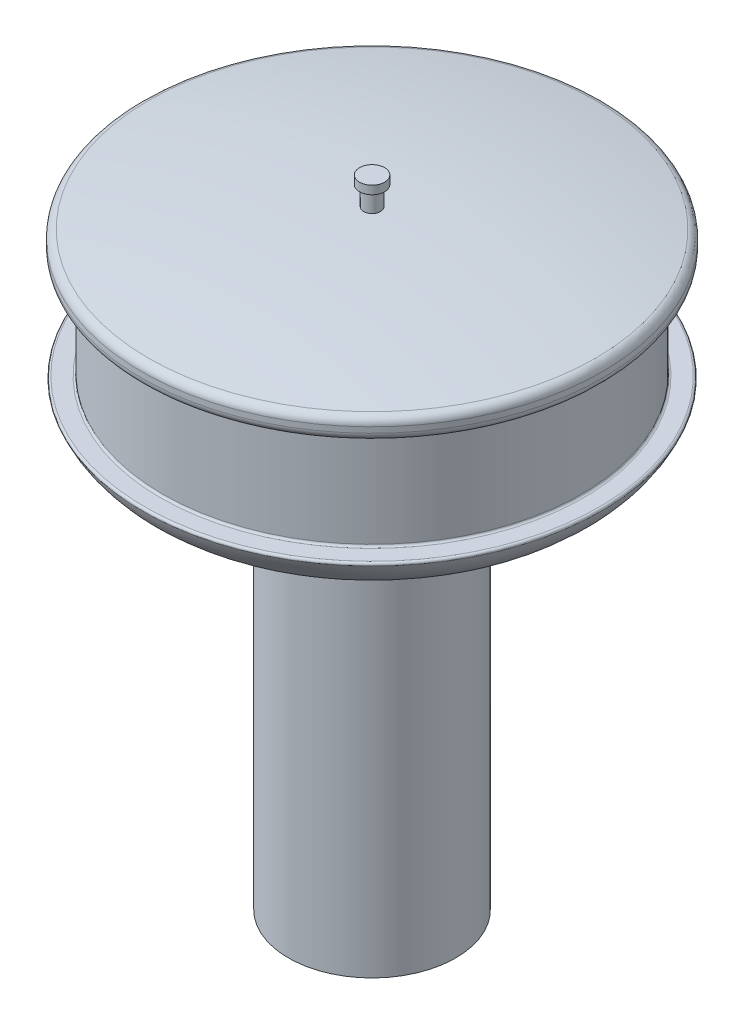
ISO-10303-21;
HEADER;
FILE_DESCRIPTION(('STEP AP214'),'2;1');
FILE_NAME('part.step','',(''),(''),'','','');
FILE_SCHEMA(('AUTOMOTIVE_DESIGN { 1 0 10303 214 1 1 1 1 }'));
ENDSEC;
DATA;
#1=APPLICATION_CONTEXT('core data for automotive mechanical design processes');
#2=APPLICATION_PROTOCOL_DEFINITION('international standard','automotive_design',2000,#1);
#3=PRODUCT_CONTEXT('',#1,'mechanical');
#4=PRODUCT('Part','Part','',(#3));
#5=PRODUCT_RELATED_PRODUCT_CATEGORY('part','',(#4));
#6=PRODUCT_DEFINITION_FORMATION('','',#4);
#7=PRODUCT_DEFINITION_CONTEXT('part definition',#1,'design');
#8=PRODUCT_DEFINITION('design','',#6,#7);
#9=PRODUCT_DEFINITION_SHAPE('','',#8);
#10=(LENGTH_UNIT() NAMED_UNIT(*) SI_UNIT(.MILLI.,.METRE.));
#11=(NAMED_UNIT(*) PLANE_ANGLE_UNIT() SI_UNIT($,.RADIAN.));
#12=(NAMED_UNIT(*) SI_UNIT($,.STERADIAN.) SOLID_ANGLE_UNIT());
#13=UNCERTAINTY_MEASURE_WITH_UNIT(LENGTH_MEASURE(1.E-05),#10,'distance_accuracy_value','');
#14=(GEOMETRIC_REPRESENTATION_CONTEXT(3) GLOBAL_UNCERTAINTY_ASSIGNED_CONTEXT((#13)) GLOBAL_UNIT_ASSIGNED_CONTEXT((#10,
#11,#12)) REPRESENTATION_CONTEXT('',''));
#15=CARTESIAN_POINT('',(0.,0.,0.));
#16=DIRECTION('',(0.,0.,1.));
#17=DIRECTION('',(1.,0.,0.));
#18=AXIS2_PLACEMENT_3D('',#15,#16,#17);
#19=CARTESIAN_POINT('',(0.,62.,0.));
#20=DIRECTION('',(0.,-1.,0.));
#21=DIRECTION('',(0.,0.,-1.));
#22=AXIS2_PLACEMENT_3D('',#19,#20,#21);
#23=PLANE('',#22);
#24=CARTESIAN_POINT('',(0.,62.,0.));
#25=DIRECTION('',(0.,-1.,0.));
#26=DIRECTION('',(0.,0.,-1.));
#27=AXIS2_PLACEMENT_3D('',#24,#25,#26);
#28=CIRCLE('',#27,40.);
#29=CARTESIAN_POINT('',(0.,62.,-40.));
#30=VERTEX_POINT('',#29);
#31=EDGE_CURVE('E75',#30,#30,#28,.T.);
#32=ORIENTED_EDGE('',*,*,#31,.F.);
#33=EDGE_LOOP('',(#32));
#34=FACE_BOUND('',#33,.T.);
#35=CARTESIAN_POINT('',(0.,62.,0.));
#36=DIRECTION('',(0.,-1.,0.));
#37=DIRECTION('',(0.,0.,-1.));
#38=AXIS2_PLACEMENT_3D('',#35,#36,#37);
#39=CIRCLE('',#38,22.);
#40=CARTESIAN_POINT('',(0.,62.,-22.));
#41=VERTEX_POINT('',#40);
#42=EDGE_CURVE('E11',#41,#41,#39,.T.);
#43=ORIENTED_EDGE('',*,*,#42,.T.);
#44=EDGE_LOOP('',(#43));
#45=FACE_BOUND('',#44,.T.);
#46=ADVANCED_FACE('F38',(#34,#45),#23,.F.);
#47=CARTESIAN_POINT('',(0.,58.,0.));
#48=DIRECTION('',(0.,-1.,0.));
#49=DIRECTION('',(0.,0.,-1.));
#50=AXIS2_PLACEMENT_3D('',#47,#48,#49);
#51=TOROIDAL_SURFACE('',#50,22.,4.);
#52=CARTESIAN_POINT('',(0.,58.,0.));
#53=DIRECTION('',(0.,-1.,0.));
#54=DIRECTION('',(0.,0.,-1.));
#55=AXIS2_PLACEMENT_3D('',#52,#53,#54);
#56=CIRCLE('',#55,18.);
#57=CARTESIAN_POINT('',(0.,58.,-18.));
#58=VERTEX_POINT('',#57);
#59=EDGE_CURVE('E44',#58,#58,#56,.T.);
#60=ORIENTED_EDGE('',*,*,#59,.T.);
#61=EDGE_LOOP('',(#60));
#62=FACE_BOUND('',#61,.T.);
#63=ORIENTED_EDGE('',*,*,#42,.F.);
#64=EDGE_LOOP('',(#63));
#65=FACE_BOUND('',#64,.T.);
#66=ADVANCED_FACE('F65',(#62,#65),#51,.T.);
#67=CARTESIAN_POINT('',(0.,0.,0.));
#68=DIRECTION('',(0.,-1.,0.));
#69=DIRECTION('',(0.,0.,-1.));
#70=AXIS2_PLACEMENT_3D('',#67,#68,#69);
#71=CYLINDRICAL_SURFACE('',#70,18.);
#72=ORIENTED_EDGE('',*,*,#59,.F.);
#73=EDGE_LOOP('',(#72));
#74=FACE_BOUND('',#73,.T.);
#75=CARTESIAN_POINT('',(0.,-40.,0.));
#76=DIRECTION('',(0.,-1.,0.));
#77=DIRECTION('',(0.,0.,-1.));
#78=AXIS2_PLACEMENT_3D('',#75,#76,#77);
#79=CIRCLE('',#78,18.);
#80=CARTESIAN_POINT('',(0.,-40.,-18.));
#81=VERTEX_POINT('',#80);
#82=EDGE_CURVE('E153',#81,#81,#79,.T.);
#83=ORIENTED_EDGE('',*,*,#82,.T.);
#84=EDGE_LOOP('',(#83));
#85=FACE_BOUND('',#84,.T.);
#86=ADVANCED_FACE('F70',(#74,#85),#71,.F.);
#87=CARTESIAN_POINT('',(0.,-40.,0.));
#88=DIRECTION('',(0.,-1.,0.));
#89=DIRECTION('',(0.,0.,-1.));
#90=AXIS2_PLACEMENT_3D('',#87,#88,#89);
#91=PLANE('',#90);
#92=CARTESIAN_POINT('',(0.,-40.,0.));
#93=DIRECTION('',(0.,-1.,0.));
#94=DIRECTION('',(0.,0.,-1.));
#95=AXIS2_PLACEMENT_3D('',#92,#93,#94);
#96=CIRCLE('',#95,20.);
#97=CARTESIAN_POINT('',(0.,-40.,-20.));
#98=VERTEX_POINT('',#97);
#99=EDGE_CURVE('E150',#98,#98,#96,.T.);
#100=ORIENTED_EDGE('',*,*,#99,.T.);
#101=EDGE_LOOP('',(#100));
#102=FACE_BOUND('',#101,.T.);
#103=ORIENTED_EDGE('',*,*,#82,.F.);
#104=EDGE_LOOP('',(#103));
#105=FACE_BOUND('',#104,.T.);
#106=ADVANCED_FACE('F160',(#102,#105),#91,.T.);
#107=CARTESIAN_POINT('',(0.,0.,0.));
#108=DIRECTION('',(0.,-1.,0.));
#109=DIRECTION('',(0.,0.,-1.));
#110=AXIS2_PLACEMENT_3D('',#107,#108,#109);
#111=CYLINDRICAL_SURFACE('',#110,20.);
#112=CARTESIAN_POINT('',(0.,58.,0.));
#113=DIRECTION('',(0.,-1.,0.));
#114=DIRECTION('',(0.,0.,-1.));
#115=AXIS2_PLACEMENT_3D('',#112,#113,#114);
#116=CIRCLE('',#115,20.);
#117=CARTESIAN_POINT('',(0.,58.,-20.));
#118=VERTEX_POINT('',#117);
#119=EDGE_CURVE('E147',#118,#118,#116,.T.);
#120=ORIENTED_EDGE('',*,*,#119,.T.);
#121=EDGE_LOOP('',(#120));
#122=FACE_BOUND('',#121,.T.);
#123=ORIENTED_EDGE('',*,*,#99,.F.);
#124=EDGE_LOOP('',(#123));
#125=FACE_BOUND('',#124,.T.);
#126=ADVANCED_FACE('F165',(#122,#125),#111,.T.);
#127=CARTESIAN_POINT('',(0.,58.,0.));
#128=DIRECTION('',(0.,-1.,0.));
#129=DIRECTION('',(0.,0.,-1.));
#130=AXIS2_PLACEMENT_3D('',#127,#128,#129);
#131=TOROIDAL_SURFACE('',#130,22.,2.);
#132=ORIENTED_EDGE('',*,*,#119,.F.);
#133=EDGE_LOOP('',(#132));
#134=FACE_BOUND('',#133,.T.);
#135=CARTESIAN_POINT('',(0.,60.,0.));
#136=DIRECTION('',(0.,-1.,0.));
#137=DIRECTION('',(0.,0.,-1.));
#138=AXIS2_PLACEMENT_3D('',#135,#136,#137);
#139=CIRCLE('',#138,22.);
#140=CARTESIAN_POINT('',(0.,60.,-22.));
#141=VERTEX_POINT('',#140);
#142=EDGE_CURVE('E144',#141,#141,#139,.T.);
#143=ORIENTED_EDGE('',*,*,#142,.T.);
#144=EDGE_LOOP('',(#143));
#145=FACE_BOUND('',#144,.T.);
#146=ADVANCED_FACE('F171',(#134,#145),#131,.F.);
#147=CARTESIAN_POINT('',(0.,60.,0.));
#148=DIRECTION('',(0.,-1.,0.));
#149=DIRECTION('',(0.,0.,-1.));
#150=AXIS2_PLACEMENT_3D('',#147,#148,#149);
#151=PLANE('',#150);
#152=CARTESIAN_POINT('',(0.,60.,0.));
#153=DIRECTION('',(0.,-1.,0.));
#154=DIRECTION('',(0.,0.,-1.));
#155=AXIS2_PLACEMENT_3D('',#152,#153,#154);
#156=CIRCLE('',#155,40.);
#157=CARTESIAN_POINT('',(0.,60.,-40.));
#158=VERTEX_POINT('',#157);
#159=EDGE_CURVE('E141',#158,#158,#156,.T.);
#160=ORIENTED_EDGE('',*,*,#159,.T.);
#161=EDGE_LOOP('',(#160));
#162=FACE_BOUND('',#161,.T.);
#163=ORIENTED_EDGE('',*,*,#142,.F.);
#164=EDGE_LOOP('',(#163));
#165=FACE_BOUND('',#164,.T.);
#166=ADVANCED_FACE('F177',(#162,#165),#151,.T.);
#167=CARTESIAN_POINT('',(0.,76.,0.));
#168=DIRECTION('',(0.,-1.,0.));
#169=DIRECTION('',(0.,0.,-1.));
#170=AXIS2_PLACEMENT_3D('',#167,#168,#169);
#171=TOROIDAL_SURFACE('',#170,40.,16.);
#172=CARTESIAN_POINT('',(0.,69.7365013028851,0.));
#173=DIRECTION('',(0.,-1.,0.));
#174=DIRECTION('',(0.,0.,-1.));
#175=AXIS2_PLACEMENT_3D('',#172,#173,#174);
#176=CIRCLE('',#175,54.7230629989565);
#177=CARTESIAN_POINT('',(0.,69.7365013028851,-54.7230629989565));
#178=VERTEX_POINT('',#177);
#179=EDGE_CURVE('E138',#178,#178,#176,.T.);
#180=ORIENTED_EDGE('',*,*,#179,.T.);
#181=EDGE_LOOP('',(#180));
#182=FACE_BOUND('',#181,.T.);
#183=ORIENTED_EDGE('',*,*,#159,.F.);
#184=EDGE_LOOP('',(#183));
#185=FACE_BOUND('',#184,.T.);
#186=ADVANCED_FACE('F181',(#182,#185),#171,.T.);
#187=CARTESIAN_POINT('',(0.,69.93223563717,0.));
#188=DIRECTION('',(0.,-1.,0.));
#189=DIRECTION('',(0.,0.,-1.));
#190=AXIS2_PLACEMENT_3D('',#187,#188,#189);
#191=TOROIDAL_SURFACE('',#190,54.2629672802391,0.499999999999995);
#192=ORIENTED_EDGE('',*,*,#179,.F.);
#193=EDGE_LOOP('',(#192));
#194=FACE_BOUND('',#193,.T.);
#195=CARTESIAN_POINT('',(0.,70.43223563717,0.));
#196=DIRECTION('',(0.,-1.,0.));
#197=DIRECTION('',(0.,0.,-1.));
#198=AXIS2_PLACEMENT_3D('',#195,#196,#197);
#199=CIRCLE('',#198,54.2629672802391);
#200=CARTESIAN_POINT('',(0.,70.43223563717,-54.2629672802391));
#201=VERTEX_POINT('',#200);
#202=EDGE_CURVE('E135',#201,#201,#199,.T.);
#203=ORIENTED_EDGE('',*,*,#202,.T.);
#204=EDGE_LOOP('',(#203));
#205=FACE_BOUND('',#204,.T.);
#206=ADVANCED_FACE('F185',(#194,#205),#191,.T.);
#207=CARTESIAN_POINT('',(2.59753420162755E-13,70.43223563717,0.));
#208=DIRECTION('',(0.,1.,0.));
#209=DIRECTION('',(0.,0.,1.));
#210=AXIS2_PLACEMENT_3D('',#207,#208,#209);
#211=PLANE('',#210);
#212=CARTESIAN_POINT('',(0.,70.43223563717,0.));
#213=DIRECTION('',(0.,-1.,0.));
#214=DIRECTION('',(0.,0.,-1.));
#215=AXIS2_PLACEMENT_3D('',#212,#213,#214);
#216=CIRCLE('',#215,50.5);
#217=CARTESIAN_POINT('',(0.,70.43223563717,-50.5));
#218=VERTEX_POINT('',#217);
#219=EDGE_CURVE('E132',#218,#218,#216,.T.);
#220=ORIENTED_EDGE('',*,*,#219,.T.);
#221=EDGE_LOOP('',(#220));
#222=FACE_BOUND('',#221,.T.);
#223=ORIENTED_EDGE('',*,*,#202,.F.);
#224=EDGE_LOOP('',(#223));
#225=FACE_BOUND('',#224,.T.);
#226=ADVANCED_FACE('F189',(#222,#225),#211,.T.);
#227=CARTESIAN_POINT('',(0.,70.93223563717,0.));
#228=DIRECTION('',(0.,-1.,0.));
#229=DIRECTION('',(0.,0.,-1.));
#230=AXIS2_PLACEMENT_3D('',#227,#228,#229);
#231=TOROIDAL_SURFACE('',#230,50.5,0.5);
#232=ORIENTED_EDGE('',*,*,#219,.F.);
#233=EDGE_LOOP('',(#232));
#234=FACE_BOUND('',#233,.T.);
#235=CARTESIAN_POINT('',(0.,70.93223563717,0.));
#236=DIRECTION('',(0.,-1.,0.));
#237=DIRECTION('',(0.,0.,-1.));
#238=AXIS2_PLACEMENT_3D('',#235,#236,#237);
#239=CIRCLE('',#238,50.);
#240=CARTESIAN_POINT('',(0.,70.93223563717,-50.));
#241=VERTEX_POINT('',#240);
#242=EDGE_CURVE('E129',#241,#241,#239,.T.);
#243=ORIENTED_EDGE('',*,*,#242,.T.);
#244=EDGE_LOOP('',(#243));
#245=FACE_BOUND('',#244,.T.);
#246=ADVANCED_FACE('F193',(#234,#245),#231,.F.);
#247=CARTESIAN_POINT('',(0.,0.,0.));
#248=DIRECTION('',(0.,-1.,0.));
#249=DIRECTION('',(0.,0.,-1.));
#250=AXIS2_PLACEMENT_3D('',#247,#248,#249);
#251=CYLINDRICAL_SURFACE('',#250,50.);
#252=CARTESIAN_POINT('',(0.,94.93223563717,0.));
#253=DIRECTION('',(0.,-1.,0.));
#254=DIRECTION('',(0.,0.,-1.));
#255=AXIS2_PLACEMENT_3D('',#252,#253,#254);
#256=CIRCLE('',#255,50.);
#257=CARTESIAN_POINT('',(0.,94.93223563717,-50.));
#258=VERTEX_POINT('',#257);
#259=EDGE_CURVE('E126',#258,#258,#256,.T.);
#260=ORIENTED_EDGE('',*,*,#259,.T.);
#261=EDGE_LOOP('',(#260));
#262=FACE_BOUND('',#261,.T.);
#263=ORIENTED_EDGE('',*,*,#242,.F.);
#264=EDGE_LOOP('',(#263));
#265=FACE_BOUND('',#264,.T.);
#266=ADVANCED_FACE('F197',(#262,#265),#251,.T.);
#267=CARTESIAN_POINT('',(0.,94.93223563717,0.));
#268=DIRECTION('',(0.,-1.,0.));
#269=DIRECTION('',(0.,0.,-1.));
#270=AXIS2_PLACEMENT_3D('',#267,#268,#269);
#271=TOROIDAL_SURFACE('',#270,50.5,0.5);
#272=ORIENTED_EDGE('',*,*,#259,.F.);
#273=EDGE_LOOP('',(#272));
#274=FACE_BOUND('',#273,.T.);
#275=CARTESIAN_POINT('',(0.,95.43223563717,0.));
#276=DIRECTION('',(0.,-1.,0.));
#277=DIRECTION('',(0.,0.,-1.));
#278=AXIS2_PLACEMENT_3D('',#275,#276,#277);
#279=CIRCLE('',#278,50.5);
#280=CARTESIAN_POINT('',(0.,95.43223563717,-50.5));
#281=VERTEX_POINT('',#280);
#282=EDGE_CURVE('E123',#281,#281,#279,.T.);
#283=ORIENTED_EDGE('',*,*,#282,.T.);
#284=EDGE_LOOP('',(#283));
#285=FACE_BOUND('',#284,.T.);
#286=ADVANCED_FACE('F201',(#274,#285),#271,.F.);
#287=CARTESIAN_POINT('',(0.,95.43223563717,0.));
#288=DIRECTION('',(0.,-1.,0.));
#289=DIRECTION('',(0.,0.,-1.));
#290=AXIS2_PLACEMENT_3D('',#287,#288,#289);
#291=PLANE('',#290);
#292=CARTESIAN_POINT('',(0.,95.43223563717,0.));
#293=DIRECTION('',(0.,-1.,0.));
#294=DIRECTION('',(0.,0.,-1.));
#295=AXIS2_PLACEMENT_3D('',#292,#293,#294);
#296=CIRCLE('',#295,53.);
#297=CARTESIAN_POINT('',(0.,95.43223563717,-53.));
#298=VERTEX_POINT('',#297);
#299=EDGE_CURVE('E120',#298,#298,#296,.T.);
#300=ORIENTED_EDGE('',*,*,#299,.T.);
#301=EDGE_LOOP('',(#300));
#302=FACE_BOUND('',#301,.T.);
#303=ORIENTED_EDGE('',*,*,#282,.F.);
#304=EDGE_LOOP('',(#303));
#305=FACE_BOUND('',#304,.T.);
#306=ADVANCED_FACE('F205',(#302,#305),#291,.T.);
#307=CARTESIAN_POINT('',(0.,97.43223563717,0.));
#308=DIRECTION('',(0.,-1.,0.));
#309=DIRECTION('',(0.,0.,-1.));
#310=AXIS2_PLACEMENT_3D('',#307,#308,#309);
#311=TOROIDAL_SURFACE('',#310,53.,2.);
#312=CARTESIAN_POINT('',(0.,97.43223563717,0.));
#313=DIRECTION('',(0.,-1.,0.));
#314=DIRECTION('',(0.,0.,-1.));
#315=AXIS2_PLACEMENT_3D('',#312,#313,#314);
#316=CIRCLE('',#315,55.);
#317=CARTESIAN_POINT('',(0.,97.43223563717,-55.));
#318=VERTEX_POINT('',#317);
#319=EDGE_CURVE('E117',#318,#318,#316,.T.);
#320=ORIENTED_EDGE('',*,*,#319,.T.);
#321=EDGE_LOOP('',(#320));
#322=FACE_BOUND('',#321,.T.);
#323=ORIENTED_EDGE('',*,*,#299,.F.);
#324=EDGE_LOOP('',(#323));
#325=FACE_BOUND('',#324,.T.);
#326=ADVANCED_FACE('F209',(#322,#325),#311,.T.);
#327=CARTESIAN_POINT('',(0.,0.,0.));
#328=DIRECTION('',(0.,-1.,0.));
#329=DIRECTION('',(0.,0.,-1.));
#330=AXIS2_PLACEMENT_3D('',#327,#328,#329);
#331=CYLINDRICAL_SURFACE('',#330,55.);
#332=ORIENTED_EDGE('',*,*,#319,.F.);
#333=EDGE_LOOP('',(#332));
#334=FACE_BOUND('',#333,.T.);
#335=CARTESIAN_POINT('',(0.,98.770348737419,0.));
#336=DIRECTION('',(0.,-1.,0.));
#337=DIRECTION('',(0.,0.,-1.));
#338=AXIS2_PLACEMENT_3D('',#335,#336,#337);
#339=CIRCLE('',#338,55.);
#340=CARTESIAN_POINT('',(0.,98.770348737419,-55.));
#341=VERTEX_POINT('',#340);
#342=EDGE_CURVE('E114',#341,#341,#339,.T.);
#343=ORIENTED_EDGE('',*,*,#342,.T.);
#344=EDGE_LOOP('',(#343));
#345=FACE_BOUND('',#344,.T.);
#346=ADVANCED_FACE('F213',(#334,#345),#331,.T.);
#347=CARTESIAN_POINT('',(0.,98.770348737419,0.));
#348=DIRECTION('',(0.,-1.,0.));
#349=DIRECTION('',(0.,0.,-1.));
#350=AXIS2_PLACEMENT_3D('',#347,#348,#349);
#351=TOROIDAL_SURFACE('',#350,53.,2.00000000000003);
#352=CARTESIAN_POINT('',(0.,100.737600445058,0.));
#353=DIRECTION('',(0.,-1.,0.));
#354=DIRECTION('',(0.,0.,-1.));
#355=AXIS2_PLACEMENT_3D('',#352,#353,#354);
#356=CIRCLE('',#355,53.3604451675248);
#357=CARTESIAN_POINT('',(0.,100.737600445058,-53.3604451675248));
#358=VERTEX_POINT('',#357);
#359=EDGE_CURVE('E111',#358,#358,#356,.T.);
#360=ORIENTED_EDGE('',*,*,#359,.T.);
#361=EDGE_LOOP('',(#360));
#362=FACE_BOUND('',#361,.T.);
#363=ORIENTED_EDGE('',*,*,#342,.F.);
#364=EDGE_LOOP('',(#363));
#365=FACE_BOUND('',#364,.T.);
#366=ADVANCED_FACE('F217',(#362,#365),#351,.T.);
#367=CARTESIAN_POINT('',(0.,-179.579442379339,0.));
#368=DIRECTION('',(0.,-1.,0.));
#369=DIRECTION('',(0.,0.,-1.));
#370=AXIS2_PLACEMENT_3D('',#367,#368,#369);
#371=DEGENERATE_TOROIDAL_SURFACE('',#370,2.00000000000004,284.983402719564,.T.);
#372=ORIENTED_EDGE('',*,*,#359,.F.);
#373=EDGE_LOOP('',(#372));
#374=FACE_BOUND('',#373,.T.);
#375=CARTESIAN_POINT('',(0.,105.403960340225,0.));
#376=DIRECTION('',(0.,-1.,0.));
#377=DIRECTION('',(0.,0.,-1.));
#378=AXIS2_PLACEMENT_3D('',#375,#376,#377);
#379=CIRCLE('',#378,2.);
#380=CARTESIAN_POINT('',(0.,105.403960340225,-2.));
#381=VERTEX_POINT('',#380);
#382=EDGE_CURVE('E107',#381,#381,#379,.T.);
#383=ORIENTED_EDGE('',*,*,#382,.T.);
#384=EDGE_LOOP('',(#383));
#385=FACE_BOUND('',#384,.T.);
#386=ADVANCED_FACE('F60',(#374,#385),#371,.T.);
#387=CARTESIAN_POINT('',(0.,0.,0.));
#388=DIRECTION('',(0.,-1.,0.));
#389=DIRECTION('',(0.,0.,-1.));
#390=AXIS2_PLACEMENT_3D('',#387,#388,#389);
#391=CYLINDRICAL_SURFACE('',#390,2.);
#392=ORIENTED_EDGE('',*,*,#382,.F.);
#393=EDGE_LOOP('',(#392));
#394=FACE_BOUND('',#393,.T.);
#395=CARTESIAN_POINT('',(0.,110.,0.));
#396=DIRECTION('',(0.,-1.,0.));
#397=DIRECTION('',(0.,0.,-1.));
#398=AXIS2_PLACEMENT_3D('',#395,#396,#397);
#399=CIRCLE('',#398,2.);
#400=CARTESIAN_POINT('',(0.,110.,-2.));
#401=VERTEX_POINT('',#400);
#402=EDGE_CURVE('E80',#401,#401,#399,.T.);
#403=ORIENTED_EDGE('',*,*,#402,.T.);
#404=EDGE_LOOP('',(#403));
#405=FACE_BOUND('',#404,.T.);
#406=ADVANCED_FACE('F50',(#394,#405),#391,.T.);
#407=CARTESIAN_POINT('',(0.,-179.579442379339,-2.00000000000004));
#408=DIRECTION('',(-1.,0.,0.));
#409=DIRECTION('',(0.,0.,-1.));
#410=AXIS2_PLACEMENT_3D('',#407,#408,#409);
#411=CIRCLE('',#410,282.983402719564);
#412=TRIMMED_CURVE('',#411,(PARAMETER_VALUE(-1.57786393793835)),
(PARAMETER_VALUE(1.57786393793835)),.T.,.PARAMETER.);
#413=CARTESIAN_POINT('',(0.,-179.579442379339,0.));
#414=DIRECTION('',(0.,-1.,0.));
#415=AXIS1_PLACEMENT('',#413,#414);
#416=SURFACE_OF_REVOLUTION('',#412,#415);
#417=CARTESIAN_POINT('',(0.,98.7703487374191,0.));
#418=DIRECTION('',(0.,-1.,0.));
#419=DIRECTION('',(0.,0.,-1.));
#420=AXIS2_PLACEMENT_3D('',#417,#418,#419);
#421=CIRCLE('',#420,53.);
#422=CARTESIAN_POINT('',(0.,98.7703487374191,-53.));
#423=VERTEX_POINT('',#422);
#424=EDGE_CURVE('E106',#423,#423,#421,.T.);
#425=ORIENTED_EDGE('',*,*,#424,.T.);
#426=EDGE_LOOP('',(#425));
#427=FACE_BOUND('',#426,.T.);
#428=CARTESIAN_POINT('',(0.,103.396892699662,0.));
#429=VERTEX_POINT('',#428);
#430=VERTEX_LOOP('',#429);
#431=FACE_BOUND('',#430,.T.);
#432=ADVANCED_FACE('F47',(#427,#431),#416,.F.);
#433=CARTESIAN_POINT('',(0.,0.,0.));
#434=DIRECTION('',(0.,-1.,0.));
#435=DIRECTION('',(0.,0.,-1.));
#436=AXIS2_PLACEMENT_3D('',#433,#434,#435);
#437=CYLINDRICAL_SURFACE('',#436,53.);
#438=CARTESIAN_POINT('',(0.,97.43223563717,0.));
#439=DIRECTION('',(0.,-1.,0.));
#440=DIRECTION('',(0.,0.,-1.));
#441=AXIS2_PLACEMENT_3D('',#438,#439,#440);
#442=CIRCLE('',#441,53.);
#443=CARTESIAN_POINT('',(0.,97.43223563717,-53.));
#444=VERTEX_POINT('',#443);
#445=EDGE_CURVE('E103',#444,#444,#442,.T.);
#446=ORIENTED_EDGE('',*,*,#445,.T.);
#447=EDGE_LOOP('',(#446));
#448=FACE_BOUND('',#447,.T.);
#449=ORIENTED_EDGE('',*,*,#424,.F.);
#450=EDGE_LOOP('',(#449));
#451=FACE_BOUND('',#450,.T.);
#452=ADVANCED_FACE('F49',(#448,#451),#437,.F.);
#453=CARTESIAN_POINT('',(0.,97.43223563717,0.));
#454=DIRECTION('',(0.,-1.,0.));
#455=DIRECTION('',(0.,0.,-1.));
#456=AXIS2_PLACEMENT_3D('',#453,#454,#455);
#457=PLANE('',#456);
#458=ORIENTED_EDGE('',*,*,#445,.F.);
#459=EDGE_LOOP('',(#458));
#460=FACE_BOUND('',#459,.T.);
#461=CARTESIAN_POINT('',(0.,97.43223563717,0.));
#462=DIRECTION('',(0.,-1.,0.));
#463=DIRECTION('',(0.,0.,-1.));
#464=AXIS2_PLACEMENT_3D('',#461,#462,#463);
#465=CIRCLE('',#464,50.5);
#466=CARTESIAN_POINT('',(0.,97.43223563717,-50.5));
#467=VERTEX_POINT('',#466);
#468=EDGE_CURVE('E100',#467,#467,#465,.T.);
#469=ORIENTED_EDGE('',*,*,#468,.T.);
#470=EDGE_LOOP('',(#469));
#471=FACE_BOUND('',#470,.T.);
#472=ADVANCED_FACE('F57',(#460,#471),#457,.F.);
#473=CARTESIAN_POINT('',(0.,94.93223563717,0.));
#474=DIRECTION('',(0.,-1.,0.));
#475=DIRECTION('',(0.,0.,-1.));
#476=AXIS2_PLACEMENT_3D('',#473,#474,#475);
#477=TOROIDAL_SURFACE('',#476,50.5,2.5);
#478=CARTESIAN_POINT('',(0.,94.93223563717,0.));
#479=DIRECTION('',(0.,-1.,0.));
#480=DIRECTION('',(0.,0.,-1.));
#481=AXIS2_PLACEMENT_3D('',#478,#479,#480);
#482=CIRCLE('',#481,48.);
#483=CARTESIAN_POINT('',(0.,94.93223563717,-48.));
#484=VERTEX_POINT('',#483);
#485=EDGE_CURVE('E97',#484,#484,#482,.T.);
#486=ORIENTED_EDGE('',*,*,#485,.T.);
#487=EDGE_LOOP('',(#486));
#488=FACE_BOUND('',#487,.T.);
#489=ORIENTED_EDGE('',*,*,#468,.F.);
#490=EDGE_LOOP('',(#489));
#491=FACE_BOUND('',#490,.T.);
#492=ADVANCED_FACE('F267',(#488,#491),#477,.T.);
#493=CARTESIAN_POINT('',(0.,0.,0.));
#494=DIRECTION('',(0.,-1.,0.));
#495=DIRECTION('',(0.,0.,-1.));
#496=AXIS2_PLACEMENT_3D('',#493,#494,#495);
#497=CYLINDRICAL_SURFACE('',#496,48.);
#498=ORIENTED_EDGE('',*,*,#485,.F.);
#499=EDGE_LOOP('',(#498));
#500=FACE_BOUND('',#499,.T.);
#501=CARTESIAN_POINT('',(0.,70.93223563717,0.));
#502=DIRECTION('',(0.,-1.,0.));
#503=DIRECTION('',(0.,0.,-1.));
#504=AXIS2_PLACEMENT_3D('',#501,#502,#503);
#505=CIRCLE('',#504,48.);
#506=CARTESIAN_POINT('',(0.,70.93223563717,-48.));
#507=VERTEX_POINT('',#506);
#508=EDGE_CURVE('E94',#507,#507,#505,.T.);
#509=ORIENTED_EDGE('',*,*,#508,.T.);
#510=EDGE_LOOP('',(#509));
#511=FACE_BOUND('',#510,.T.);
#512=ADVANCED_FACE('F263',(#500,#511),#497,.F.);
#513=CARTESIAN_POINT('',(0.,70.93223563717,0.));
#514=DIRECTION('',(0.,-1.,0.));
#515=DIRECTION('',(0.,0.,-1.));
#516=AXIS2_PLACEMENT_3D('',#513,#514,#515);
#517=TOROIDAL_SURFACE('',#516,50.5,2.5);
#518=CARTESIAN_POINT('',(0.,68.43223563717,0.));
#519=DIRECTION('',(0.,-1.,0.));
#520=DIRECTION('',(0.,0.,-1.));
#521=AXIS2_PLACEMENT_3D('',#518,#519,#520);
#522=CIRCLE('',#521,50.5);
#523=CARTESIAN_POINT('',(0.,68.43223563717,-50.5));
#524=VERTEX_POINT('',#523);
#525=EDGE_CURVE('E83',#524,#524,#522,.T.);
#526=ORIENTED_EDGE('',*,*,#525,.T.);
#527=EDGE_LOOP('',(#526));
#528=FACE_BOUND('',#527,.T.);
#529=ORIENTED_EDGE('',*,*,#508,.F.);
#530=EDGE_LOOP('',(#529));
#531=FACE_BOUND('',#530,.T.);
#532=ADVANCED_FACE('F259',(#528,#531),#517,.T.);
#533=CARTESIAN_POINT('',(0.,68.43223563717,0.));
#534=DIRECTION('',(0.,1.,0.));
#535=DIRECTION('',(0.,0.,1.));
#536=AXIS2_PLACEMENT_3D('',#533,#534,#535);
#537=PLANE('',#536);
#538=ORIENTED_EDGE('',*,*,#525,.F.);
#539=EDGE_LOOP('',(#538));
#540=FACE_BOUND('',#539,.T.);
#541=CARTESIAN_POINT('',(0.,68.43223563717,0.));
#542=DIRECTION('',(0.,-1.,0.));
#543=DIRECTION('',(0.,0.,-1.));
#544=AXIS2_PLACEMENT_3D('',#541,#542,#543);
#545=CIRCLE('',#544,51.778325116445);
#546=CARTESIAN_POINT('',(0.,68.43223563717,-51.778325116445));
#547=VERTEX_POINT('',#546);
#548=EDGE_CURVE('E79',#547,#547,#545,.T.);
#549=ORIENTED_EDGE('',*,*,#548,.T.);
#550=EDGE_LOOP('',(#549));
#551=FACE_BOUND('',#550,.T.);
#552=ADVANCED_FACE('F253',(#540,#551),#537,.F.);
#553=CARTESIAN_POINT('',(0.,76.,0.));
#554=DIRECTION('',(0.,-1.,0.));
#555=DIRECTION('',(0.,0.,-1.));
#556=AXIS2_PLACEMENT_3D('',#553,#554,#555);
#557=TOROIDAL_SURFACE('',#556,40.,14.);
#558=ORIENTED_EDGE('',*,*,#548,.F.);
#559=EDGE_LOOP('',(#558));
#560=FACE_BOUND('',#559,.T.);
#561=ORIENTED_EDGE('',*,*,#31,.T.);
#562=EDGE_LOOP('',(#561));
#563=FACE_BOUND('',#562,.T.);
#564=ADVANCED_FACE('F246',(#560,#563),#557,.F.);
#565=CARTESIAN_POINT('',(0.,112.,0.));
#566=DIRECTION('',(0.,-1.,0.));
#567=DIRECTION('',(0.,0.,-1.));
#568=AXIS2_PLACEMENT_3D('',#565,#566,#567);
#569=CYLINDRICAL_SURFACE('',#568,3.);
#570=CARTESIAN_POINT('',(0.,112.,0.));
#571=DIRECTION('',(0.,1.,0.));
#572=DIRECTION('',(0.,0.,1.));
#573=AXIS2_PLACEMENT_3D('',#570,#571,#572);
#574=CIRCLE('',#573,3.);
#575=CARTESIAN_POINT('',(0.,112.,3.));
#576=VERTEX_POINT('',#575);
#577=EDGE_CURVE('E86',#576,#576,#574,.T.);
#578=ORIENTED_EDGE('',*,*,#577,.F.);
#579=EDGE_LOOP('',(#578));
#580=FACE_BOUND('',#579,.T.);
#581=CARTESIAN_POINT('',(0.,110.,0.));
#582=DIRECTION('',(0.,1.,0.));
#583=DIRECTION('',(0.,0.,1.));
#584=AXIS2_PLACEMENT_3D('',#581,#582,#583);
#585=CIRCLE('',#584,3.);
#586=CARTESIAN_POINT('',(0.,110.,3.));
#587=VERTEX_POINT('',#586);
#588=EDGE_CURVE('E89',#587,#587,#585,.T.);
#589=ORIENTED_EDGE('',*,*,#588,.T.);
#590=EDGE_LOOP('',(#589));
#591=FACE_BOUND('',#590,.T.);
#592=ADVANCED_FACE('F244',(#580,#591),#569,.T.);
#593=CARTESIAN_POINT('',(0.,112.,0.));
#594=DIRECTION('',(0.,1.,0.));
#595=DIRECTION('',(0.,0.,1.));
#596=AXIS2_PLACEMENT_3D('',#593,#594,#595);
#597=PLANE('',#596);
#598=ORIENTED_EDGE('',*,*,#577,.T.);
#599=EDGE_LOOP('',(#598));
#600=FACE_BOUND('',#599,.T.);
#601=ADVANCED_FACE('F235',(#600),#597,.T.);
#602=CARTESIAN_POINT('',(0.,110.,0.));
#603=DIRECTION('',(0.,1.,0.));
#604=DIRECTION('',(0.,0.,1.));
#605=AXIS2_PLACEMENT_3D('',#602,#603,#604);
#606=PLANE('',#605);
#607=ORIENTED_EDGE('',*,*,#402,.F.);
#608=EDGE_LOOP('',(#607));
#609=FACE_BOUND('',#608,.T.);
#610=ORIENTED_EDGE('',*,*,#588,.F.);
#611=EDGE_LOOP('',(#610));
#612=FACE_BOUND('',#611,.T.);
#613=ADVANCED_FACE('F232',(#609,#612),#606,.F.);
#614=CLOSED_SHELL('',(#46,#66,#86,#106,#126,#146,#166,#186,#206,#226,#246,#266,#286,#306,#326,
#346,#366,#386,#406,#432,#452,#472,#492,#512,#532,#552,#564,#592,#601,#613));
#615=MANIFOLD_SOLID_BREP('B2',#614);
#616=ADVANCED_BREP_SHAPE_REPRESENTATION('',(#18,#615),#14);
#617=SHAPE_DEFINITION_REPRESENTATION(#9,#616);
ENDSEC;
END-ISO-10303-21;
